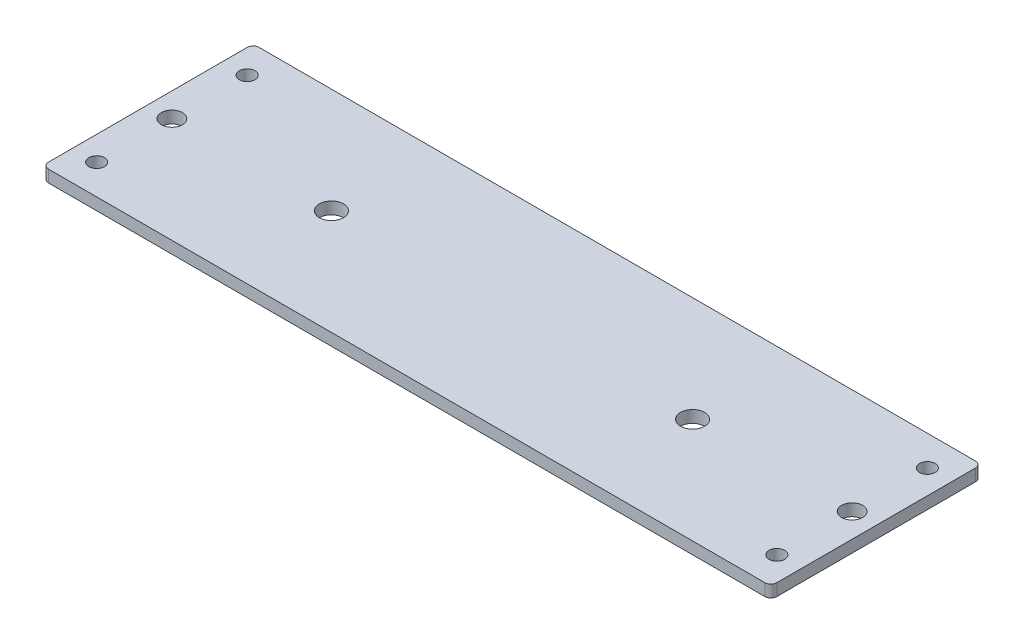
ISO-10303-21;
HEADER;
FILE_DESCRIPTION(('STEP AP214'),'2;1');
FILE_NAME('part.step','',(''),(''),'','','');
FILE_SCHEMA(('AUTOMOTIVE_DESIGN { 1 0 10303 214 1 1 1 1 }'));
ENDSEC;
DATA;
#1=APPLICATION_CONTEXT('core data for automotive mechanical design processes');
#2=APPLICATION_PROTOCOL_DEFINITION('international standard','automotive_design',2000,#1);
#3=PRODUCT_CONTEXT('',#1,'mechanical');
#4=PRODUCT('Part','Part','',(#3));
#5=PRODUCT_RELATED_PRODUCT_CATEGORY('part','',(#4));
#6=PRODUCT_DEFINITION_FORMATION('','',#4);
#7=PRODUCT_DEFINITION_CONTEXT('part definition',#1,'design');
#8=PRODUCT_DEFINITION('design','',#6,#7);
#9=PRODUCT_DEFINITION_SHAPE('','',#8);
#10=(LENGTH_UNIT() NAMED_UNIT(*) SI_UNIT(.MILLI.,.METRE.));
#11=(NAMED_UNIT(*) PLANE_ANGLE_UNIT() SI_UNIT($,.RADIAN.));
#12=(NAMED_UNIT(*) SI_UNIT($,.STERADIAN.) SOLID_ANGLE_UNIT());
#13=UNCERTAINTY_MEASURE_WITH_UNIT(LENGTH_MEASURE(1.E-05),#10,'distance_accuracy_value','');
#14=(GEOMETRIC_REPRESENTATION_CONTEXT(3) GLOBAL_UNCERTAINTY_ASSIGNED_CONTEXT((#13)) GLOBAL_UNIT_ASSIGNED_CONTEXT((#10,
#11,#12)) REPRESENTATION_CONTEXT('',''));
#15=CARTESIAN_POINT('',(0.,0.,0.));
#16=DIRECTION('',(0.,0.,1.));
#17=DIRECTION('',(1.,0.,0.));
#18=AXIS2_PLACEMENT_3D('',#15,#16,#17);
#19=CARTESIAN_POINT('',(121.,4.,-35.));
#20=DIRECTION('',(-1.,0.,0.));
#21=DIRECTION('',(0.,0.,1.));
#22=AXIS2_PLACEMENT_3D('',#19,#20,#21);
#23=PLANE('',#22);
#24=DIRECTION('',(0.,0.,-1.));
#25=VECTOR('',#24,1.);
#26=CARTESIAN_POINT('',(121.,0.,-35.));
#27=LINE('',#26,#25);
#28=CARTESIAN_POINT('',(121.,0.,33.));
#29=VERTEX_POINT('',#28);
#30=CARTESIAN_POINT('',(121.,0.,-33.));
#31=VERTEX_POINT('',#30);
#32=EDGE_CURVE('E130',#29,#31,#27,.T.);
#33=ORIENTED_EDGE('',*,*,#32,.T.);
#34=DIRECTION('',(0.,-1.,0.));
#35=VECTOR('',#34,1.);
#36=CARTESIAN_POINT('',(121.,4.,-33.));
#37=LINE('',#36,#35);
#38=CARTESIAN_POINT('',(121.,4.,-33.));
#39=VERTEX_POINT('',#38);
#40=EDGE_CURVE('E108',#31,#39,#37,.F.);
#41=ORIENTED_EDGE('',*,*,#40,.T.);
#42=DIRECTION('',(0.,0.,-1.));
#43=VECTOR('',#42,1.);
#44=CARTESIAN_POINT('',(121.,4.,-35.));
#45=LINE('',#44,#43);
#46=CARTESIAN_POINT('',(121.,4.,33.));
#47=VERTEX_POINT('',#46);
#48=EDGE_CURVE('E140',#47,#39,#45,.T.);
#49=ORIENTED_EDGE('',*,*,#48,.F.);
#50=DIRECTION('',(0.,-1.,0.));
#51=VECTOR('',#50,1.);
#52=CARTESIAN_POINT('',(121.,4.,33.));
#53=LINE('',#52,#51);
#54=EDGE_CURVE('E113',#47,#29,#53,.T.);
#55=ORIENTED_EDGE('',*,*,#54,.T.);
#56=EDGE_LOOP('',(#33,#41,#49,#55));
#57=FACE_BOUND('',#56,.T.);
#58=ADVANCED_FACE('F37',(#57),#23,.F.);
#59=CARTESIAN_POINT('',(-121.,4.,-35.));
#60=DIRECTION('',(0.,0.,1.));
#61=DIRECTION('',(1.,0.,0.));
#62=AXIS2_PLACEMENT_3D('',#59,#60,#61);
#63=PLANE('',#62);
#64=DIRECTION('',(-1.,0.,0.));
#65=VECTOR('',#64,1.);
#66=CARTESIAN_POINT('',(-121.,4.,-35.));
#67=LINE('',#66,#65);
#68=CARTESIAN_POINT('',(119.,4.,-35.));
#69=VERTEX_POINT('',#68);
#70=CARTESIAN_POINT('',(-119.,4.,-35.));
#71=VERTEX_POINT('',#70);
#72=EDGE_CURVE('E123',#69,#71,#67,.T.);
#73=ORIENTED_EDGE('',*,*,#72,.F.);
#74=DIRECTION('',(0.,-1.,0.));
#75=VECTOR('',#74,1.);
#76=CARTESIAN_POINT('',(119.,4.,-35.));
#77=LINE('',#76,#75);
#78=CARTESIAN_POINT('',(119.,0.,-35.));
#79=VERTEX_POINT('',#78);
#80=EDGE_CURVE('E107',#69,#79,#77,.T.);
#81=ORIENTED_EDGE('',*,*,#80,.T.);
#82=DIRECTION('',(-1.,0.,0.));
#83=VECTOR('',#82,1.);
#84=CARTESIAN_POINT('',(-121.,0.,-35.));
#85=LINE('',#84,#83);
#86=CARTESIAN_POINT('',(-119.,0.,-35.));
#87=VERTEX_POINT('',#86);
#88=EDGE_CURVE('E120',#79,#87,#85,.T.);
#89=ORIENTED_EDGE('',*,*,#88,.T.);
#90=DIRECTION('',(0.,-1.,0.));
#91=VECTOR('',#90,1.);
#92=CARTESIAN_POINT('',(-119.,4.,-35.));
#93=LINE('',#92,#91);
#94=EDGE_CURVE('E125',#87,#71,#93,.F.);
#95=ORIENTED_EDGE('',*,*,#94,.T.);
#96=EDGE_LOOP('',(#73,#81,#89,#95));
#97=FACE_BOUND('',#96,.T.);
#98=ADVANCED_FACE('F119',(#97),#63,.F.);
#99=CARTESIAN_POINT('',(-121.,4.,-35.));
#100=DIRECTION('',(1.,0.,0.));
#101=DIRECTION('',(0.,0.,-1.));
#102=AXIS2_PLACEMENT_3D('',#99,#100,#101);
#103=PLANE('',#102);
#104=DIRECTION('',(0.,0.,1.));
#105=VECTOR('',#104,1.);
#106=CARTESIAN_POINT('',(-121.,0.,-35.));
#107=LINE('',#106,#105);
#108=CARTESIAN_POINT('',(-121.,0.,-33.));
#109=VERTEX_POINT('',#108);
#110=CARTESIAN_POINT('',(-121.,0.,33.));
#111=VERTEX_POINT('',#110);
#112=EDGE_CURVE('E129',#109,#111,#107,.T.);
#113=ORIENTED_EDGE('',*,*,#112,.T.);
#114=DIRECTION('',(0.,-1.,0.));
#115=VECTOR('',#114,1.);
#116=CARTESIAN_POINT('',(-121.,4.,33.));
#117=LINE('',#116,#115);
#118=CARTESIAN_POINT('',(-121.,4.,33.));
#119=VERTEX_POINT('',#118);
#120=EDGE_CURVE('E11',#111,#119,#117,.F.);
#121=ORIENTED_EDGE('',*,*,#120,.T.);
#122=DIRECTION('',(0.,0.,1.));
#123=VECTOR('',#122,1.);
#124=CARTESIAN_POINT('',(-121.,4.,-35.));
#125=LINE('',#124,#123);
#126=CARTESIAN_POINT('',(-121.,4.,-33.));
#127=VERTEX_POINT('',#126);
#128=EDGE_CURVE('E166',#127,#119,#125,.T.);
#129=ORIENTED_EDGE('',*,*,#128,.F.);
#130=DIRECTION('',(0.,-1.,0.));
#131=VECTOR('',#130,1.);
#132=CARTESIAN_POINT('',(-121.,4.,-33.));
#133=LINE('',#132,#131);
#134=EDGE_CURVE('E45',#127,#109,#133,.T.);
#135=ORIENTED_EDGE('',*,*,#134,.T.);
#136=EDGE_LOOP('',(#113,#121,#129,#135));
#137=FACE_BOUND('',#136,.T.);
#138=ADVANCED_FACE('F164',(#137),#103,.F.);
#139=CARTESIAN_POINT('',(-121.,4.,35.));
#140=DIRECTION('',(0.,0.,-1.));
#141=DIRECTION('',(-1.,0.,0.));
#142=AXIS2_PLACEMENT_3D('',#139,#140,#141);
#143=PLANE('',#142);
#144=DIRECTION('',(1.,0.,0.));
#145=VECTOR('',#144,1.);
#146=CARTESIAN_POINT('',(-121.,0.,35.));
#147=LINE('',#146,#145);
#148=CARTESIAN_POINT('',(-119.,0.,35.));
#149=VERTEX_POINT('',#148);
#150=CARTESIAN_POINT('',(119.,0.,35.));
#151=VERTEX_POINT('',#150);
#152=EDGE_CURVE('E133',#149,#151,#147,.T.);
#153=ORIENTED_EDGE('',*,*,#152,.T.);
#154=DIRECTION('',(0.,-1.,0.));
#155=VECTOR('',#154,1.);
#156=CARTESIAN_POINT('',(119.,4.,35.));
#157=LINE('',#156,#155);
#158=CARTESIAN_POINT('',(119.,4.,35.));
#159=VERTEX_POINT('',#158);
#160=EDGE_CURVE('E52',#151,#159,#157,.F.);
#161=ORIENTED_EDGE('',*,*,#160,.T.);
#162=DIRECTION('',(1.,0.,0.));
#163=VECTOR('',#162,1.);
#164=CARTESIAN_POINT('',(-121.,4.,35.));
#165=LINE('',#164,#163);
#166=CARTESIAN_POINT('',(-119.,4.,35.));
#167=VERTEX_POINT('',#166);
#168=EDGE_CURVE('E141',#167,#159,#165,.T.);
#169=ORIENTED_EDGE('',*,*,#168,.F.);
#170=DIRECTION('',(0.,-1.,0.));
#171=VECTOR('',#170,1.);
#172=CARTESIAN_POINT('',(-119.,4.,35.));
#173=LINE('',#172,#171);
#174=EDGE_CURVE('E157',#167,#149,#173,.T.);
#175=ORIENTED_EDGE('',*,*,#174,.T.);
#176=EDGE_LOOP('',(#153,#161,#169,#175));
#177=FACE_BOUND('',#176,.T.);
#178=ADVANCED_FACE('F173',(#177),#143,.F.);
#179=CARTESIAN_POINT('',(0.,4.,0.));
#180=DIRECTION('',(0.,1.,0.));
#181=DIRECTION('',(0.,0.,1.));
#182=AXIS2_PLACEMENT_3D('',#179,#180,#181);
#183=PLANE('',#182);
#184=CARTESIAN_POINT('',(-113.,4.,-25.));
#185=DIRECTION('',(0.,1.,0.));
#186=DIRECTION('',(0.,0.,1.));
#187=AXIS2_PLACEMENT_3D('',#184,#185,#186);
#188=CIRCLE('',#187,2.59999999999999);
#189=CARTESIAN_POINT('',(-113.,4.,-22.4));
#190=VERTEX_POINT('',#189);
#191=EDGE_CURVE('E198',#190,#190,#188,.T.);
#192=ORIENTED_EDGE('',*,*,#191,.F.);
#193=EDGE_LOOP('',(#192));
#194=FACE_BOUND('',#193,.T.);
#195=CARTESIAN_POINT('',(60.,4.,0.));
#196=DIRECTION('',(0.,1.,0.));
#197=DIRECTION('',(0.,0.,-1.));
#198=AXIS2_PLACEMENT_3D('',#195,#196,#197);
#199=CIRCLE('',#198,4.00000000000001);
#200=CARTESIAN_POINT('',(60.,4.,-3.99999999999999));
#201=VERTEX_POINT('',#200);
#202=EDGE_CURVE('E205',#201,#201,#199,.T.);
#203=ORIENTED_EDGE('',*,*,#202,.F.);
#204=EDGE_LOOP('',(#203));
#205=FACE_BOUND('',#204,.T.);
#206=CARTESIAN_POINT('',(-60.,4.,0.));
#207=DIRECTION('',(0.,1.,0.));
#208=DIRECTION('',(0.,0.,1.));
#209=AXIS2_PLACEMENT_3D('',#206,#207,#208);
#210=CIRCLE('',#209,4.00000000000001);
#211=CARTESIAN_POINT('',(-60.,4.,4.00000000000003));
#212=VERTEX_POINT('',#211);
#213=EDGE_CURVE('E186',#212,#212,#210,.T.);
#214=ORIENTED_EDGE('',*,*,#213,.F.);
#215=EDGE_LOOP('',(#214));
#216=FACE_BOUND('',#215,.T.);
#217=CARTESIAN_POINT('',(113.,4.,0.));
#218=DIRECTION('',(0.,1.,0.));
#219=DIRECTION('',(0.,0.,-1.));
#220=AXIS2_PLACEMENT_3D('',#217,#218,#219);
#221=CIRCLE('',#220,3.50000000000001);
#222=CARTESIAN_POINT('',(113.,4.,-3.50000000000003));
#223=VERTEX_POINT('',#222);
#224=EDGE_CURVE('E193',#223,#223,#221,.T.);
#225=ORIENTED_EDGE('',*,*,#224,.F.);
#226=EDGE_LOOP('',(#225));
#227=FACE_BOUND('',#226,.T.);
#228=CARTESIAN_POINT('',(-113.,4.,25.));
#229=DIRECTION('',(0.,1.,0.));
#230=DIRECTION('',(0.,0.,-1.));
#231=AXIS2_PLACEMENT_3D('',#228,#229,#230);
#232=CIRCLE('',#231,2.59999999999999);
#233=CARTESIAN_POINT('',(-113.,4.,22.4));
#234=VERTEX_POINT('',#233);
#235=EDGE_CURVE('E222',#234,#234,#232,.T.);
#236=ORIENTED_EDGE('',*,*,#235,.F.);
#237=EDGE_LOOP('',(#236));
#238=FACE_BOUND('',#237,.T.);
#239=CARTESIAN_POINT('',(113.,4.,25.));
#240=DIRECTION('',(0.,1.,0.));
#241=DIRECTION('',(0.,0.,1.));
#242=AXIS2_PLACEMENT_3D('',#239,#240,#241);
#243=CIRCLE('',#242,2.59999999999999);
#244=CARTESIAN_POINT('',(113.,4.,27.6));
#245=VERTEX_POINT('',#244);
#246=EDGE_CURVE('E216',#245,#245,#243,.T.);
#247=ORIENTED_EDGE('',*,*,#246,.F.);
#248=EDGE_LOOP('',(#247));
#249=FACE_BOUND('',#248,.T.);
#250=CARTESIAN_POINT('',(113.,4.,-25.));
#251=DIRECTION('',(0.,1.,0.));
#252=DIRECTION('',(0.,0.,-1.));
#253=AXIS2_PLACEMENT_3D('',#250,#251,#252);
#254=CIRCLE('',#253,2.59999999999999);
#255=CARTESIAN_POINT('',(113.,4.,-27.6));
#256=VERTEX_POINT('',#255);
#257=EDGE_CURVE('E210',#256,#256,#254,.T.);
#258=ORIENTED_EDGE('',*,*,#257,.F.);
#259=EDGE_LOOP('',(#258));
#260=FACE_BOUND('',#259,.T.);
#261=CARTESIAN_POINT('',(-113.,4.,0.));
#262=DIRECTION('',(0.,1.,0.));
#263=DIRECTION('',(0.,0.,1.));
#264=AXIS2_PLACEMENT_3D('',#261,#262,#263);
#265=CIRCLE('',#264,3.50000000000001);
#266=CARTESIAN_POINT('',(-113.,4.,3.50000000000001));
#267=VERTEX_POINT('',#266);
#268=EDGE_CURVE('E180',#267,#267,#265,.T.);
#269=ORIENTED_EDGE('',*,*,#268,.F.);
#270=EDGE_LOOP('',(#269));
#271=FACE_BOUND('',#270,.T.);
#272=ORIENTED_EDGE('',*,*,#48,.T.);
#273=CARTESIAN_POINT('',(119.,4.,-33.));
#274=DIRECTION('',(0.,1.,0.));
#275=DIRECTION('',(0.,0.,1.));
#276=AXIS2_PLACEMENT_3D('',#273,#274,#275);
#277=CIRCLE('',#276,2.);
#278=EDGE_CURVE('E155',#39,#69,#277,.T.);
#279=ORIENTED_EDGE('',*,*,#278,.T.);
#280=ORIENTED_EDGE('',*,*,#72,.T.);
#281=CARTESIAN_POINT('',(-119.,4.,-33.));
#282=DIRECTION('',(0.,1.,0.));
#283=DIRECTION('',(0.,0.,1.));
#284=AXIS2_PLACEMENT_3D('',#281,#282,#283);
#285=CIRCLE('',#284,2.);
#286=EDGE_CURVE('E150',#71,#127,#285,.T.);
#287=ORIENTED_EDGE('',*,*,#286,.T.);
#288=ORIENTED_EDGE('',*,*,#128,.T.);
#289=CARTESIAN_POINT('',(-119.,4.,33.));
#290=DIRECTION('',(0.,1.,0.));
#291=DIRECTION('',(0.,0.,1.));
#292=AXIS2_PLACEMENT_3D('',#289,#290,#291);
#293=CIRCLE('',#292,2.);
#294=EDGE_CURVE('E59',#119,#167,#293,.T.);
#295=ORIENTED_EDGE('',*,*,#294,.T.);
#296=ORIENTED_EDGE('',*,*,#168,.T.);
#297=CARTESIAN_POINT('',(119.,4.,33.));
#298=DIRECTION('',(0.,1.,0.));
#299=DIRECTION('',(0.,0.,1.));
#300=AXIS2_PLACEMENT_3D('',#297,#298,#299);
#301=CIRCLE('',#300,2.);
#302=EDGE_CURVE('E153',#159,#47,#301,.T.);
#303=ORIENTED_EDGE('',*,*,#302,.T.);
#304=EDGE_LOOP('',(#272,#279,#280,#287,#288,#295,#296,#303));
#305=FACE_BOUND('',#304,.T.);
#306=ADVANCED_FACE('F238',(#194,#205,#216,#227,#238,#249,#260,#271,#305),#183,.T.);
#307=CARTESIAN_POINT('',(0.,0.,0.));
#308=DIRECTION('',(0.,1.,0.));
#309=DIRECTION('',(0.,0.,1.));
#310=AXIS2_PLACEMENT_3D('',#307,#308,#309);
#311=PLANE('',#310);
#312=CARTESIAN_POINT('',(-113.,0.,-25.));
#313=DIRECTION('',(0.,1.,0.));
#314=DIRECTION('',(0.,0.,1.));
#315=AXIS2_PLACEMENT_3D('',#312,#313,#314);
#316=CIRCLE('',#315,2.59999999999999);
#317=CARTESIAN_POINT('',(-113.,0.,-22.4));
#318=VERTEX_POINT('',#317);
#319=EDGE_CURVE('E201',#318,#318,#316,.T.);
#320=ORIENTED_EDGE('',*,*,#319,.T.);
#321=EDGE_LOOP('',(#320));
#322=FACE_BOUND('',#321,.T.);
#323=CARTESIAN_POINT('',(60.,0.,0.));
#324=DIRECTION('',(0.,1.,0.));
#325=DIRECTION('',(0.,0.,-1.));
#326=AXIS2_PLACEMENT_3D('',#323,#324,#325);
#327=CIRCLE('',#326,4.00000000000001);
#328=CARTESIAN_POINT('',(60.,0.,-3.99999999999999));
#329=VERTEX_POINT('',#328);
#330=EDGE_CURVE('E190',#329,#329,#327,.T.);
#331=ORIENTED_EDGE('',*,*,#330,.T.);
#332=EDGE_LOOP('',(#331));
#333=FACE_BOUND('',#332,.T.);
#334=CARTESIAN_POINT('',(-60.,0.,0.));
#335=DIRECTION('',(0.,1.,0.));
#336=DIRECTION('',(0.,0.,1.));
#337=AXIS2_PLACEMENT_3D('',#334,#335,#336);
#338=CIRCLE('',#337,4.00000000000001);
#339=CARTESIAN_POINT('',(-60.,0.,4.00000000000003));
#340=VERTEX_POINT('',#339);
#341=EDGE_CURVE('E189',#340,#340,#338,.T.);
#342=ORIENTED_EDGE('',*,*,#341,.T.);
#343=EDGE_LOOP('',(#342));
#344=FACE_BOUND('',#343,.T.);
#345=CARTESIAN_POINT('',(113.,0.,0.));
#346=DIRECTION('',(0.,1.,0.));
#347=DIRECTION('',(0.,0.,-1.));
#348=AXIS2_PLACEMENT_3D('',#345,#346,#347);
#349=CIRCLE('',#348,3.50000000000001);
#350=CARTESIAN_POINT('',(113.,0.,-3.50000000000003));
#351=VERTEX_POINT('',#350);
#352=EDGE_CURVE('E183',#351,#351,#349,.T.);
#353=ORIENTED_EDGE('',*,*,#352,.T.);
#354=EDGE_LOOP('',(#353));
#355=FACE_BOUND('',#354,.T.);
#356=CARTESIAN_POINT('',(-113.,0.,25.));
#357=DIRECTION('',(0.,1.,0.));
#358=DIRECTION('',(0.,0.,-1.));
#359=AXIS2_PLACEMENT_3D('',#356,#357,#358);
#360=CIRCLE('',#359,2.59999999999999);
#361=CARTESIAN_POINT('',(-113.,0.,22.4));
#362=VERTEX_POINT('',#361);
#363=EDGE_CURVE('E202',#362,#362,#360,.T.);
#364=ORIENTED_EDGE('',*,*,#363,.T.);
#365=EDGE_LOOP('',(#364));
#366=FACE_BOUND('',#365,.T.);
#367=CARTESIAN_POINT('',(113.,0.,25.));
#368=DIRECTION('',(0.,1.,0.));
#369=DIRECTION('',(0.,0.,1.));
#370=AXIS2_PLACEMENT_3D('',#367,#368,#369);
#371=CIRCLE('',#370,2.59999999999999);
#372=CARTESIAN_POINT('',(113.,0.,27.6));
#373=VERTEX_POINT('',#372);
#374=EDGE_CURVE('E219',#373,#373,#371,.T.);
#375=ORIENTED_EDGE('',*,*,#374,.T.);
#376=EDGE_LOOP('',(#375));
#377=FACE_BOUND('',#376,.T.);
#378=CARTESIAN_POINT('',(113.,0.,-25.));
#379=DIRECTION('',(0.,1.,0.));
#380=DIRECTION('',(0.,0.,-1.));
#381=AXIS2_PLACEMENT_3D('',#378,#379,#380);
#382=CIRCLE('',#381,2.59999999999999);
#383=CARTESIAN_POINT('',(113.,0.,-27.6));
#384=VERTEX_POINT('',#383);
#385=EDGE_CURVE('E213',#384,#384,#382,.T.);
#386=ORIENTED_EDGE('',*,*,#385,.T.);
#387=EDGE_LOOP('',(#386));
#388=FACE_BOUND('',#387,.T.);
#389=CARTESIAN_POINT('',(-113.,0.,0.));
#390=DIRECTION('',(0.,1.,0.));
#391=DIRECTION('',(0.,0.,1.));
#392=AXIS2_PLACEMENT_3D('',#389,#390,#391);
#393=CIRCLE('',#392,3.50000000000001);
#394=CARTESIAN_POINT('',(-113.,0.,3.50000000000001));
#395=VERTEX_POINT('',#394);
#396=EDGE_CURVE('E135',#395,#395,#393,.T.);
#397=ORIENTED_EDGE('',*,*,#396,.T.);
#398=EDGE_LOOP('',(#397));
#399=FACE_BOUND('',#398,.T.);
#400=ORIENTED_EDGE('',*,*,#88,.F.);
#401=CARTESIAN_POINT('',(119.,0.,-33.));
#402=DIRECTION('',(0.,1.,0.));
#403=DIRECTION('',(0.,0.,1.));
#404=AXIS2_PLACEMENT_3D('',#401,#402,#403);
#405=CIRCLE('',#404,2.);
#406=EDGE_CURVE('E103',#79,#31,#405,.F.);
#407=ORIENTED_EDGE('',*,*,#406,.T.);
#408=ORIENTED_EDGE('',*,*,#32,.F.);
#409=CARTESIAN_POINT('',(119.,0.,33.));
#410=DIRECTION('',(0.,1.,0.));
#411=DIRECTION('',(0.,0.,1.));
#412=AXIS2_PLACEMENT_3D('',#409,#410,#411);
#413=CIRCLE('',#412,2.);
#414=EDGE_CURVE('E114',#29,#151,#413,.F.);
#415=ORIENTED_EDGE('',*,*,#414,.T.);
#416=ORIENTED_EDGE('',*,*,#152,.F.);
#417=CARTESIAN_POINT('',(-119.,0.,33.));
#418=DIRECTION('',(0.,1.,0.));
#419=DIRECTION('',(0.,0.,1.));
#420=AXIS2_PLACEMENT_3D('',#417,#418,#419);
#421=CIRCLE('',#420,2.);
#422=EDGE_CURVE('E144',#149,#111,#421,.F.);
#423=ORIENTED_EDGE('',*,*,#422,.T.);
#424=ORIENTED_EDGE('',*,*,#112,.F.);
#425=CARTESIAN_POINT('',(-119.,0.,-33.));
#426=DIRECTION('',(0.,1.,0.));
#427=DIRECTION('',(0.,0.,1.));
#428=AXIS2_PLACEMENT_3D('',#425,#426,#427);
#429=CIRCLE('',#428,2.);
#430=EDGE_CURVE('E124',#109,#87,#429,.F.);
#431=ORIENTED_EDGE('',*,*,#430,.T.);
#432=EDGE_LOOP('',(#400,#407,#408,#415,#416,#423,#424,#431));
#433=FACE_BOUND('',#432,.T.);
#434=ADVANCED_FACE('F127',(#322,#333,#344,#355,#366,#377,#388,#399,#433),#311,.F.);
#435=CARTESIAN_POINT('',(-113.,0.,0.));
#436=DIRECTION('',(0.,1.,0.));
#437=DIRECTION('',(0.,0.,1.));
#438=AXIS2_PLACEMENT_3D('',#435,#436,#437);
#439=CYLINDRICAL_SURFACE('',#438,3.50000000000001);
#440=ORIENTED_EDGE('',*,*,#396,.F.);
#441=EDGE_LOOP('',(#440));
#442=FACE_BOUND('',#441,.T.);
#443=ORIENTED_EDGE('',*,*,#268,.T.);
#444=EDGE_LOOP('',(#443));
#445=FACE_BOUND('',#444,.T.);
#446=ADVANCED_FACE('F273',(#442,#445),#439,.F.);
#447=CARTESIAN_POINT('',(113.,0.,-25.));
#448=DIRECTION('',(0.,1.,0.));
#449=DIRECTION('',(0.,0.,1.));
#450=AXIS2_PLACEMENT_3D('',#447,#448,#449);
#451=CYLINDRICAL_SURFACE('',#450,2.59999999999999);
#452=ORIENTED_EDGE('',*,*,#385,.F.);
#453=EDGE_LOOP('',(#452));
#454=FACE_BOUND('',#453,.T.);
#455=ORIENTED_EDGE('',*,*,#257,.T.);
#456=EDGE_LOOP('',(#455));
#457=FACE_BOUND('',#456,.T.);
#458=ADVANCED_FACE('F278',(#454,#457),#451,.F.);
#459=CARTESIAN_POINT('',(113.,0.,25.));
#460=DIRECTION('',(0.,1.,0.));
#461=DIRECTION('',(0.,0.,1.));
#462=AXIS2_PLACEMENT_3D('',#459,#460,#461);
#463=CYLINDRICAL_SURFACE('',#462,2.59999999999999);
#464=ORIENTED_EDGE('',*,*,#374,.F.);
#465=EDGE_LOOP('',(#464));
#466=FACE_BOUND('',#465,.T.);
#467=ORIENTED_EDGE('',*,*,#246,.T.);
#468=EDGE_LOOP('',(#467));
#469=FACE_BOUND('',#468,.T.);
#470=ADVANCED_FACE('F234',(#466,#469),#463,.F.);
#471=CARTESIAN_POINT('',(-113.,0.,25.));
#472=DIRECTION('',(0.,1.,0.));
#473=DIRECTION('',(0.,0.,1.));
#474=AXIS2_PLACEMENT_3D('',#471,#472,#473);
#475=CYLINDRICAL_SURFACE('',#474,2.59999999999999);
#476=ORIENTED_EDGE('',*,*,#363,.F.);
#477=EDGE_LOOP('',(#476));
#478=FACE_BOUND('',#477,.T.);
#479=ORIENTED_EDGE('',*,*,#235,.T.);
#480=EDGE_LOOP('',(#479));
#481=FACE_BOUND('',#480,.T.);
#482=ADVANCED_FACE('F230',(#478,#481),#475,.F.);
#483=CARTESIAN_POINT('',(113.,0.,0.));
#484=DIRECTION('',(0.,1.,0.));
#485=DIRECTION('',(0.,0.,1.));
#486=AXIS2_PLACEMENT_3D('',#483,#484,#485);
#487=CYLINDRICAL_SURFACE('',#486,3.50000000000001);
#488=ORIENTED_EDGE('',*,*,#352,.F.);
#489=EDGE_LOOP('',(#488));
#490=FACE_BOUND('',#489,.T.);
#491=ORIENTED_EDGE('',*,*,#224,.T.);
#492=EDGE_LOOP('',(#491));
#493=FACE_BOUND('',#492,.T.);
#494=ADVANCED_FACE('F233',(#490,#493),#487,.F.);
#495=CARTESIAN_POINT('',(-60.,0.,0.));
#496=DIRECTION('',(0.,1.,0.));
#497=DIRECTION('',(0.,0.,1.));
#498=AXIS2_PLACEMENT_3D('',#495,#496,#497);
#499=CYLINDRICAL_SURFACE('',#498,4.00000000000001);
#500=ORIENTED_EDGE('',*,*,#341,.F.);
#501=EDGE_LOOP('',(#500));
#502=FACE_BOUND('',#501,.T.);
#503=ORIENTED_EDGE('',*,*,#213,.T.);
#504=EDGE_LOOP('',(#503));
#505=FACE_BOUND('',#504,.T.);
#506=ADVANCED_FACE('F280',(#502,#505),#499,.F.);
#507=CARTESIAN_POINT('',(60.,0.,0.));
#508=DIRECTION('',(0.,1.,0.));
#509=DIRECTION('',(0.,0.,1.));
#510=AXIS2_PLACEMENT_3D('',#507,#508,#509);
#511=CYLINDRICAL_SURFACE('',#510,4.00000000000001);
#512=ORIENTED_EDGE('',*,*,#330,.F.);
#513=EDGE_LOOP('',(#512));
#514=FACE_BOUND('',#513,.T.);
#515=ORIENTED_EDGE('',*,*,#202,.T.);
#516=EDGE_LOOP('',(#515));
#517=FACE_BOUND('',#516,.T.);
#518=ADVANCED_FACE('F283',(#514,#517),#511,.F.);
#519=CARTESIAN_POINT('',(-113.,0.,-25.));
#520=DIRECTION('',(0.,1.,0.));
#521=DIRECTION('',(0.,0.,1.));
#522=AXIS2_PLACEMENT_3D('',#519,#520,#521);
#523=CYLINDRICAL_SURFACE('',#522,2.59999999999999);
#524=ORIENTED_EDGE('',*,*,#319,.F.);
#525=EDGE_LOOP('',(#524));
#526=FACE_BOUND('',#525,.T.);
#527=ORIENTED_EDGE('',*,*,#191,.T.);
#528=EDGE_LOOP('',(#527));
#529=FACE_BOUND('',#528,.T.);
#530=ADVANCED_FACE('F259',(#526,#529),#523,.F.);
#531=CARTESIAN_POINT('',(119.,4.,-33.));
#532=DIRECTION('',(0.,-1.,0.));
#533=DIRECTION('',(0.,0.,-1.));
#534=AXIS2_PLACEMENT_3D('',#531,#532,#533);
#535=CYLINDRICAL_SURFACE('',#534,2.);
#536=ORIENTED_EDGE('',*,*,#278,.F.);
#537=ORIENTED_EDGE('',*,*,#40,.F.);
#538=ORIENTED_EDGE('',*,*,#406,.F.);
#539=ORIENTED_EDGE('',*,*,#80,.F.);
#540=EDGE_LOOP('',(#536,#537,#538,#539));
#541=FACE_BOUND('',#540,.T.);
#542=ADVANCED_FACE('F106',(#541),#535,.T.);
#543=CARTESIAN_POINT('',(119.,4.,33.));
#544=DIRECTION('',(0.,-1.,0.));
#545=DIRECTION('',(0.,0.,-1.));
#546=AXIS2_PLACEMENT_3D('',#543,#544,#545);
#547=CYLINDRICAL_SURFACE('',#546,2.);
#548=ORIENTED_EDGE('',*,*,#302,.F.);
#549=ORIENTED_EDGE('',*,*,#160,.F.);
#550=ORIENTED_EDGE('',*,*,#414,.F.);
#551=ORIENTED_EDGE('',*,*,#54,.F.);
#552=EDGE_LOOP('',(#548,#549,#550,#551));
#553=FACE_BOUND('',#552,.T.);
#554=ADVANCED_FACE('F252',(#553),#547,.T.);
#555=CARTESIAN_POINT('',(-119.,4.,33.));
#556=DIRECTION('',(0.,-1.,0.));
#557=DIRECTION('',(0.,0.,-1.));
#558=AXIS2_PLACEMENT_3D('',#555,#556,#557);
#559=CYLINDRICAL_SURFACE('',#558,2.);
#560=ORIENTED_EDGE('',*,*,#294,.F.);
#561=ORIENTED_EDGE('',*,*,#120,.F.);
#562=ORIENTED_EDGE('',*,*,#422,.F.);
#563=ORIENTED_EDGE('',*,*,#174,.F.);
#564=EDGE_LOOP('',(#560,#561,#562,#563));
#565=FACE_BOUND('',#564,.T.);
#566=ADVANCED_FACE('F172',(#565),#559,.T.);
#567=CARTESIAN_POINT('',(-119.,4.,-33.));
#568=DIRECTION('',(0.,-1.,0.));
#569=DIRECTION('',(0.,0.,-1.));
#570=AXIS2_PLACEMENT_3D('',#567,#568,#569);
#571=CYLINDRICAL_SURFACE('',#570,2.);
#572=ORIENTED_EDGE('',*,*,#286,.F.);
#573=ORIENTED_EDGE('',*,*,#94,.F.);
#574=ORIENTED_EDGE('',*,*,#430,.F.);
#575=ORIENTED_EDGE('',*,*,#134,.F.);
#576=EDGE_LOOP('',(#572,#573,#574,#575));
#577=FACE_BOUND('',#576,.T.);
#578=ADVANCED_FACE('F39',(#577),#571,.T.);
#579=CLOSED_SHELL('',(#58,#98,#138,#178,#306,#434,#446,#458,#470,#482,#494,#506,#518,#530,#542,
#554,#566,#578));
#580=MANIFOLD_SOLID_BREP('B2',#579);
#581=ADVANCED_BREP_SHAPE_REPRESENTATION('',(#18,#580),#14);
#582=SHAPE_DEFINITION_REPRESENTATION(#9,#581);
ENDSEC;
END-ISO-10303-21;
